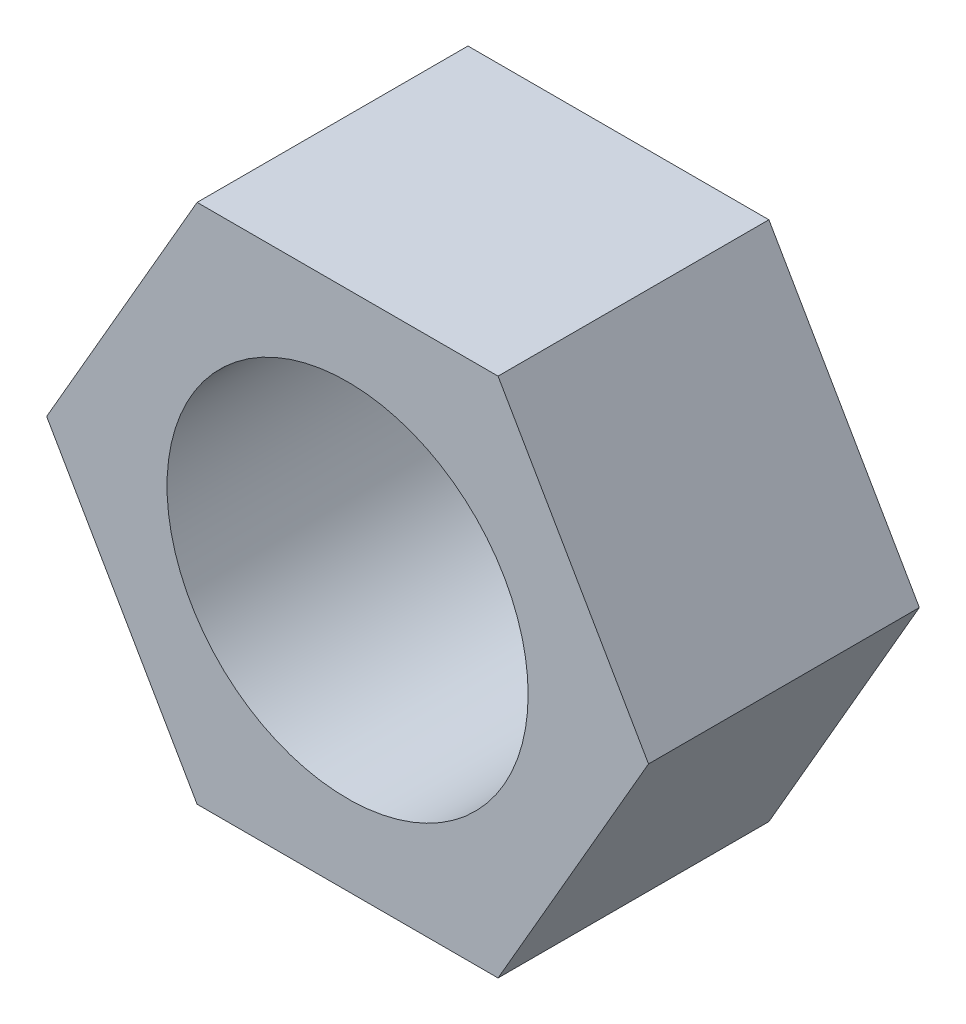
ISO-10303-21;
HEADER;
FILE_DESCRIPTION(('STEP AP214'),'2;1');
FILE_NAME('part.step','',(''),(''),'','','');
FILE_SCHEMA(('AUTOMOTIVE_DESIGN { 1 0 10303 214 1 1 1 1 }'));
ENDSEC;
DATA;
#1=APPLICATION_CONTEXT('core data for automotive mechanical design processes');
#2=APPLICATION_PROTOCOL_DEFINITION('international standard','automotive_design',2000,#1);
#3=PRODUCT_CONTEXT('',#1,'mechanical');
#4=PRODUCT('Part','Part','',(#3));
#5=PRODUCT_RELATED_PRODUCT_CATEGORY('part','',(#4));
#6=PRODUCT_DEFINITION_FORMATION('','',#4);
#7=PRODUCT_DEFINITION_CONTEXT('part definition',#1,'design');
#8=PRODUCT_DEFINITION('design','',#6,#7);
#9=PRODUCT_DEFINITION_SHAPE('','',#8);
#10=(LENGTH_UNIT() NAMED_UNIT(*) SI_UNIT(.MILLI.,.METRE.));
#11=(NAMED_UNIT(*) PLANE_ANGLE_UNIT() SI_UNIT($,.RADIAN.));
#12=(NAMED_UNIT(*) SI_UNIT($,.STERADIAN.) SOLID_ANGLE_UNIT());
#13=UNCERTAINTY_MEASURE_WITH_UNIT(LENGTH_MEASURE(1.E-05),#10,'distance_accuracy_value','');
#14=(GEOMETRIC_REPRESENTATION_CONTEXT(3) GLOBAL_UNCERTAINTY_ASSIGNED_CONTEXT((#13)) GLOBAL_UNIT_ASSIGNED_CONTEXT((#10,
#11,#12)) REPRESENTATION_CONTEXT('',''));
#15=CARTESIAN_POINT('',(0.,0.,0.));
#16=DIRECTION('',(0.,0.,1.));
#17=DIRECTION('',(1.,0.,0.));
#18=AXIS2_PLACEMENT_3D('',#15,#16,#17);
#19=CARTESIAN_POINT('',(0.,0.,9.));
#20=DIRECTION('',(0.,0.,1.));
#21=DIRECTION('',(1.,0.,0.));
#22=AXIS2_PLACEMENT_3D('',#19,#20,#21);
#23=PLANE('',#22);
#24=DIRECTION('',(-0.5,0.866025403784439,0.));
#25=VECTOR('',#24,1.);
#26=CARTESIAN_POINT('',(20.,0.,9.));
#27=LINE('',#26,#25);
#28=CARTESIAN_POINT('',(20.,0.,9.));
#29=VERTEX_POINT('',#28);
#30=CARTESIAN_POINT('',(10.,17.3205080756888,9.));
#31=VERTEX_POINT('',#30);
#32=EDGE_CURVE('E129',#29,#31,#27,.T.);
#33=ORIENTED_EDGE('',*,*,#32,.T.);
#34=DIRECTION('',(-1.,0.,0.));
#35=VECTOR('',#34,1.);
#36=CARTESIAN_POINT('',(10.,17.3205080756888,9.));
#37=LINE('',#36,#35);
#38=CARTESIAN_POINT('',(-10.,17.3205080756888,9.));
#39=VERTEX_POINT('',#38);
#40=EDGE_CURVE('E87',#31,#39,#37,.T.);
#41=ORIENTED_EDGE('',*,*,#40,.T.);
#42=DIRECTION('',(-0.5,-0.866025403784439,0.));
#43=VECTOR('',#42,1.);
#44=CARTESIAN_POINT('',(-10.,17.3205080756888,9.));
#45=LINE('',#44,#43);
#46=CARTESIAN_POINT('',(-20.,0.,9.));
#47=VERTEX_POINT('',#46);
#48=EDGE_CURVE('E100',#39,#47,#45,.T.);
#49=ORIENTED_EDGE('',*,*,#48,.T.);
#50=DIRECTION('',(0.5,-0.866025403784438,0.));
#51=VECTOR('',#50,1.);
#52=CARTESIAN_POINT('',(-20.,0.,9.));
#53=LINE('',#52,#51);
#54=CARTESIAN_POINT('',(-9.99999999999999,-17.3205080756888,9.));
#55=VERTEX_POINT('',#54);
#56=EDGE_CURVE('E94',#47,#55,#53,.T.);
#57=ORIENTED_EDGE('',*,*,#56,.T.);
#58=DIRECTION('',(1.,0.,0.));
#59=VECTOR('',#58,1.);
#60=CARTESIAN_POINT('',(-9.99999999999999,-17.3205080756888,9.));
#61=LINE('',#60,#59);
#62=CARTESIAN_POINT('',(10.,-17.3205080756888,9.));
#63=VERTEX_POINT('',#62);
#64=EDGE_CURVE('E98',#55,#63,#61,.T.);
#65=ORIENTED_EDGE('',*,*,#64,.T.);
#66=DIRECTION('',(0.5,0.866025403784439,0.));
#67=VECTOR('',#66,1.);
#68=CARTESIAN_POINT('',(10.,-17.3205080756888,9.));
#69=LINE('',#68,#67);
#70=EDGE_CURVE('E50',#63,#29,#69,.T.);
#71=ORIENTED_EDGE('',*,*,#70,.T.);
#72=EDGE_LOOP('',(#33,#41,#49,#57,#65,#71));
#73=FACE_BOUND('',#72,.T.);
#74=CARTESIAN_POINT('',(0.,0.,9.));
#75=DIRECTION('',(0.,0.,1.));
#76=DIRECTION('',(1.,0.,0.));
#77=AXIS2_PLACEMENT_3D('',#74,#75,#76);
#78=CIRCLE('',#77,12.);
#79=CARTESIAN_POINT('',(12.,0.,9.));
#80=VERTEX_POINT('',#79);
#81=EDGE_CURVE('E122',#80,#80,#78,.T.);
#82=ORIENTED_EDGE('',*,*,#81,.F.);
#83=EDGE_LOOP('',(#82));
#84=FACE_BOUND('',#83,.T.);
#85=ADVANCED_FACE('F33',(#73,#84),#23,.T.);
#86=CARTESIAN_POINT('',(0.,0.,-9.));
#87=DIRECTION('',(0.,0.,1.));
#88=DIRECTION('',(1.,0.,0.));
#89=AXIS2_PLACEMENT_3D('',#86,#87,#88);
#90=PLANE('',#89);
#91=DIRECTION('',(-0.5,0.866025403784439,0.));
#92=VECTOR('',#91,1.);
#93=CARTESIAN_POINT('',(20.,0.,-9.));
#94=LINE('',#93,#92);
#95=CARTESIAN_POINT('',(20.,0.,-9.));
#96=VERTEX_POINT('',#95);
#97=CARTESIAN_POINT('',(10.,17.3205080756888,-9.));
#98=VERTEX_POINT('',#97);
#99=EDGE_CURVE('E118',#96,#98,#94,.T.);
#100=ORIENTED_EDGE('',*,*,#99,.F.);
#101=DIRECTION('',(0.5,0.866025403784439,0.));
#102=VECTOR('',#101,1.);
#103=CARTESIAN_POINT('',(10.,-17.3205080756888,-9.));
#104=LINE('',#103,#102);
#105=CARTESIAN_POINT('',(10.,-17.3205080756888,-9.));
#106=VERTEX_POINT('',#105);
#107=EDGE_CURVE('E79',#106,#96,#104,.T.);
#108=ORIENTED_EDGE('',*,*,#107,.F.);
#109=DIRECTION('',(1.,0.,0.));
#110=VECTOR('',#109,1.);
#111=CARTESIAN_POINT('',(-9.99999999999999,-17.3205080756888,-9.));
#112=LINE('',#111,#110);
#113=CARTESIAN_POINT('',(-9.99999999999999,-17.3205080756888,-9.));
#114=VERTEX_POINT('',#113);
#115=EDGE_CURVE('E73',#114,#106,#112,.T.);
#116=ORIENTED_EDGE('',*,*,#115,.F.);
#117=DIRECTION('',(0.5,-0.866025403784438,0.));
#118=VECTOR('',#117,1.);
#119=CARTESIAN_POINT('',(-20.,0.,-9.));
#120=LINE('',#119,#118);
#121=CARTESIAN_POINT('',(-20.,0.,-9.));
#122=VERTEX_POINT('',#121);
#123=EDGE_CURVE('E108',#122,#114,#120,.T.);
#124=ORIENTED_EDGE('',*,*,#123,.F.);
#125=DIRECTION('',(-0.5,-0.866025403784439,0.));
#126=VECTOR('',#125,1.);
#127=CARTESIAN_POINT('',(-10.,17.3205080756888,-9.));
#128=LINE('',#127,#126);
#129=CARTESIAN_POINT('',(-10.,17.3205080756888,-9.));
#130=VERTEX_POINT('',#129);
#131=EDGE_CURVE('E124',#130,#122,#128,.T.);
#132=ORIENTED_EDGE('',*,*,#131,.F.);
#133=DIRECTION('',(-1.,0.,0.));
#134=VECTOR('',#133,1.);
#135=CARTESIAN_POINT('',(10.,17.3205080756888,-9.));
#136=LINE('',#135,#134);
#137=EDGE_CURVE('E121',#98,#130,#136,.T.);
#138=ORIENTED_EDGE('',*,*,#137,.F.);
#139=EDGE_LOOP('',(#100,#108,#116,#124,#132,#138));
#140=FACE_BOUND('',#139,.T.);
#141=CARTESIAN_POINT('',(0.,0.,-9.));
#142=DIRECTION('',(0.,0.,1.));
#143=DIRECTION('',(1.,0.,0.));
#144=AXIS2_PLACEMENT_3D('',#141,#142,#143);
#145=CIRCLE('',#144,12.);
#146=CARTESIAN_POINT('',(12.,0.,-9.));
#147=VERTEX_POINT('',#146);
#148=EDGE_CURVE('E222',#147,#147,#145,.T.);
#149=ORIENTED_EDGE('',*,*,#148,.T.);
#150=EDGE_LOOP('',(#149));
#151=FACE_BOUND('',#150,.T.);
#152=ADVANCED_FACE('F138',(#140,#151),#90,.F.);
#153=CARTESIAN_POINT('',(20.,0.,9.));
#154=DIRECTION('',(-0.866025403784439,-0.5,0.));
#155=DIRECTION('',(0.5,-0.866025403784439,0.));
#156=AXIS2_PLACEMENT_3D('',#153,#154,#155);
#157=PLANE('',#156);
#158=ORIENTED_EDGE('',*,*,#99,.T.);
#159=DIRECTION('',(0.,0.,-1.));
#160=VECTOR('',#159,1.);
#161=CARTESIAN_POINT('',(10.,17.3205080756888,9.));
#162=LINE('',#161,#160);
#163=EDGE_CURVE('E11',#31,#98,#162,.T.);
#164=ORIENTED_EDGE('',*,*,#163,.F.);
#165=ORIENTED_EDGE('',*,*,#32,.F.);
#166=DIRECTION('',(0.,0.,-1.));
#167=VECTOR('',#166,1.);
#168=CARTESIAN_POINT('',(20.,0.,9.));
#169=LINE('',#168,#167);
#170=EDGE_CURVE('E114',#29,#96,#169,.T.);
#171=ORIENTED_EDGE('',*,*,#170,.T.);
#172=EDGE_LOOP('',(#158,#164,#165,#171));
#173=FACE_BOUND('',#172,.T.);
#174=ADVANCED_FACE('F35',(#173),#157,.F.);
#175=CARTESIAN_POINT('',(10.,17.3205080756888,9.));
#176=DIRECTION('',(0.,-1.,0.));
#177=DIRECTION('',(1.,0.,0.));
#178=AXIS2_PLACEMENT_3D('',#175,#176,#177);
#179=PLANE('',#178);
#180=ORIENTED_EDGE('',*,*,#137,.T.);
#181=DIRECTION('',(0.,0.,-1.));
#182=VECTOR('',#181,1.);
#183=CARTESIAN_POINT('',(-10.,17.3205080756888,9.));
#184=LINE('',#183,#182);
#185=EDGE_CURVE('E42',#39,#130,#184,.T.);
#186=ORIENTED_EDGE('',*,*,#185,.F.);
#187=ORIENTED_EDGE('',*,*,#40,.F.);
#188=ORIENTED_EDGE('',*,*,#163,.T.);
#189=EDGE_LOOP('',(#180,#186,#187,#188));
#190=FACE_BOUND('',#189,.T.);
#191=ADVANCED_FACE('F163',(#190),#179,.F.);
#192=CARTESIAN_POINT('',(-10.,17.3205080756888,9.));
#193=DIRECTION('',(0.866025403784439,-0.5,0.));
#194=DIRECTION('',(0.5,0.866025403784439,0.));
#195=AXIS2_PLACEMENT_3D('',#192,#193,#194);
#196=PLANE('',#195);
#197=ORIENTED_EDGE('',*,*,#131,.T.);
#198=DIRECTION('',(0.,0.,-1.));
#199=VECTOR('',#198,1.);
#200=CARTESIAN_POINT('',(-20.,0.,9.));
#201=LINE('',#200,#199);
#202=EDGE_CURVE('E109',#47,#122,#201,.T.);
#203=ORIENTED_EDGE('',*,*,#202,.F.);
#204=ORIENTED_EDGE('',*,*,#48,.F.);
#205=ORIENTED_EDGE('',*,*,#185,.T.);
#206=EDGE_LOOP('',(#197,#203,#204,#205));
#207=FACE_BOUND('',#206,.T.);
#208=ADVANCED_FACE('F135',(#207),#196,.F.);
#209=CARTESIAN_POINT('',(-20.,0.,9.));
#210=DIRECTION('',(0.866025403784438,0.5,0.));
#211=DIRECTION('',(-0.5,0.866025403784439,0.));
#212=AXIS2_PLACEMENT_3D('',#209,#210,#211);
#213=PLANE('',#212);
#214=ORIENTED_EDGE('',*,*,#123,.T.);
#215=DIRECTION('',(0.,0.,-1.));
#216=VECTOR('',#215,1.);
#217=CARTESIAN_POINT('',(-9.99999999999999,-17.3205080756888,9.));
#218=LINE('',#217,#216);
#219=EDGE_CURVE('E105',#55,#114,#218,.T.);
#220=ORIENTED_EDGE('',*,*,#219,.F.);
#221=ORIENTED_EDGE('',*,*,#56,.F.);
#222=ORIENTED_EDGE('',*,*,#202,.T.);
#223=EDGE_LOOP('',(#214,#220,#221,#222));
#224=FACE_BOUND('',#223,.T.);
#225=ADVANCED_FACE('F106',(#224),#213,.F.);
#226=CARTESIAN_POINT('',(-9.99999999999999,-17.3205080756888,9.));
#227=DIRECTION('',(0.,1.,0.));
#228=DIRECTION('',(-1.,0.,0.));
#229=AXIS2_PLACEMENT_3D('',#226,#227,#228);
#230=PLANE('',#229);
#231=ORIENTED_EDGE('',*,*,#115,.T.);
#232=DIRECTION('',(0.,0.,-1.));
#233=VECTOR('',#232,1.);
#234=CARTESIAN_POINT('',(10.,-17.3205080756888,9.));
#235=LINE('',#234,#233);
#236=EDGE_CURVE('E110',#63,#106,#235,.T.);
#237=ORIENTED_EDGE('',*,*,#236,.F.);
#238=ORIENTED_EDGE('',*,*,#64,.F.);
#239=ORIENTED_EDGE('',*,*,#219,.T.);
#240=EDGE_LOOP('',(#231,#237,#238,#239));
#241=FACE_BOUND('',#240,.T.);
#242=ADVANCED_FACE('F112',(#241),#230,.F.);
#243=CARTESIAN_POINT('',(10.,-17.3205080756888,9.));
#244=DIRECTION('',(-0.866025403784439,0.5,0.));
#245=DIRECTION('',(-0.5,-0.866025403784439,0.));
#246=AXIS2_PLACEMENT_3D('',#243,#244,#245);
#247=PLANE('',#246);
#248=ORIENTED_EDGE('',*,*,#107,.T.);
#249=ORIENTED_EDGE('',*,*,#170,.F.);
#250=ORIENTED_EDGE('',*,*,#70,.F.);
#251=ORIENTED_EDGE('',*,*,#236,.T.);
#252=EDGE_LOOP('',(#248,#249,#250,#251));
#253=FACE_BOUND('',#252,.T.);
#254=ADVANCED_FACE('F143',(#253),#247,.F.);
#255=CARTESIAN_POINT('',(0.,0.,9.));
#256=DIRECTION('',(0.,0.,-1.));
#257=DIRECTION('',(-1.,0.,0.));
#258=AXIS2_PLACEMENT_3D('',#255,#256,#257);
#259=CYLINDRICAL_SURFACE('',#258,12.);
#260=ORIENTED_EDGE('',*,*,#81,.T.);
#261=EDGE_LOOP('',(#260));
#262=FACE_BOUND('',#261,.T.);
#263=ORIENTED_EDGE('',*,*,#148,.F.);
#264=EDGE_LOOP('',(#263));
#265=FACE_BOUND('',#264,.T.);
#266=ADVANCED_FACE('F145',(#262,#265),#259,.F.);
#267=CLOSED_SHELL('',(#85,#152,#174,#191,#208,#225,#242,#254,#266));
#268=MANIFOLD_SOLID_BREP('B2',#267);
#269=ADVANCED_BREP_SHAPE_REPRESENTATION('',(#18,#268),#14);
#270=SHAPE_DEFINITION_REPRESENTATION(#9,#269);
ENDSEC;
END-ISO-10303-21;
